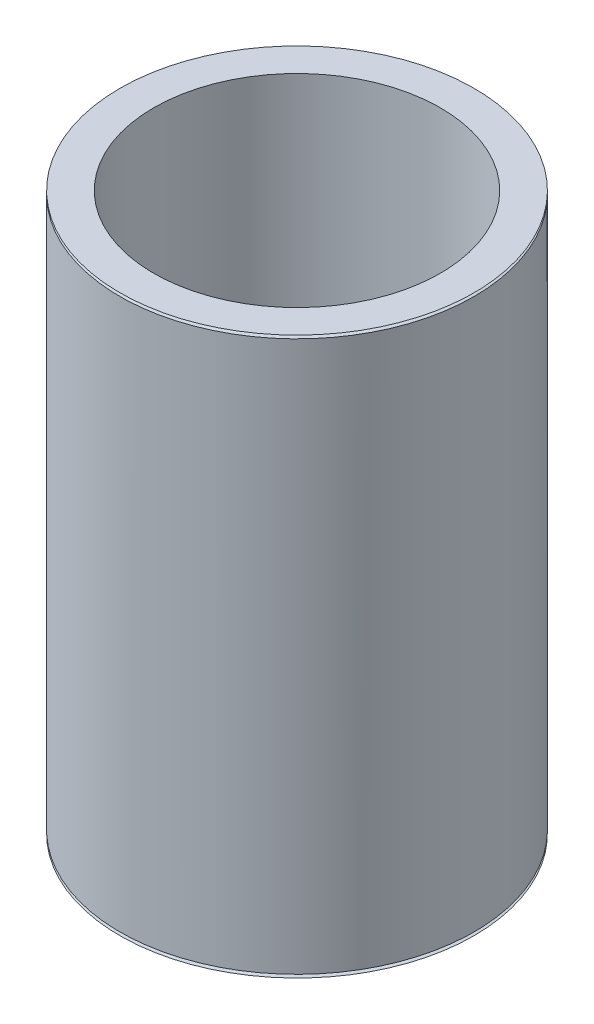
ISO-10303-21;
HEADER;
FILE_DESCRIPTION(('STEP AP214'),'2;1');
FILE_NAME('part.step','',(''),(''),'','','');
FILE_SCHEMA(('AUTOMOTIVE_DESIGN { 1 0 10303 214 1 1 1 1 }'));
ENDSEC;
DATA;
#1=APPLICATION_CONTEXT('core data for automotive mechanical design processes');
#2=APPLICATION_PROTOCOL_DEFINITION('international standard','automotive_design',2000,#1);
#3=PRODUCT_CONTEXT('',#1,'mechanical');
#4=PRODUCT('Part','Part','',(#3));
#5=PRODUCT_RELATED_PRODUCT_CATEGORY('part','',(#4));
#6=PRODUCT_DEFINITION_FORMATION('','',#4);
#7=PRODUCT_DEFINITION_CONTEXT('part definition',#1,'design');
#8=PRODUCT_DEFINITION('design','',#6,#7);
#9=PRODUCT_DEFINITION_SHAPE('','',#8);
#10=(LENGTH_UNIT() NAMED_UNIT(*) SI_UNIT(.MILLI.,.METRE.));
#11=(NAMED_UNIT(*) PLANE_ANGLE_UNIT() SI_UNIT($,.RADIAN.));
#12=(NAMED_UNIT(*) SI_UNIT($,.STERADIAN.) SOLID_ANGLE_UNIT());
#13=UNCERTAINTY_MEASURE_WITH_UNIT(LENGTH_MEASURE(1.E-05),#10,'distance_accuracy_value','');
#14=(GEOMETRIC_REPRESENTATION_CONTEXT(3) GLOBAL_UNCERTAINTY_ASSIGNED_CONTEXT((#13)) GLOBAL_UNIT_ASSIGNED_CONTEXT((#10,
#11,#12)) REPRESENTATION_CONTEXT('',''));
#15=CARTESIAN_POINT('',(0.,0.,0.));
#16=DIRECTION('',(0.,0.,1.));
#17=DIRECTION('',(1.,0.,0.));
#18=AXIS2_PLACEMENT_3D('',#15,#16,#17);
#19=CARTESIAN_POINT('',(0.,0.2339613525166,0.));
#20=DIRECTION('',(0.,-1.,0.));
#21=DIRECTION('',(-1.,0.,0.));
#22=AXIS2_PLACEMENT_3D('',#19,#20,#21);
#23=CONICAL_SURFACE('',#22,52.40859016499,1.32469745646832);
#24=CARTESIAN_POINT('',(0.,0.,0.));
#25=DIRECTION('',(0.,-1.,0.));
#26=DIRECTION('',(1.,0.,0.));
#27=AXIS2_PLACEMENT_3D('',#24,#25,#26);
#28=CIRCLE('',#27,53.34);
#29=CARTESIAN_POINT('',(53.34,-6.41153796721028E-13,0.));
#30=VERTEX_POINT('',#29);
#31=EDGE_CURVE('E101',#30,#30,#28,.T.);
#32=ORIENTED_EDGE('',*,*,#31,.F.);
#33=DIRECTION('',(-0.969870201350335,0.243622233247833,0.));
#34=VECTOR('',#33,1.);
#35=CARTESIAN_POINT('',(52.40859016499,0.2339613525166,0.));
#36=LINE('',#35,#34);
#37=CARTESIAN_POINT('',(51.4771803299801,0.46792270503385,0.));
#38=VERTEX_POINT('',#37);
#39=EDGE_CURVE('E11',#30,#38,#36,.T.);
#40=ORIENTED_EDGE('',*,*,#39,.T.);
#41=CARTESIAN_POINT('',(0.,0.4679227050333,0.));
#42=DIRECTION('',(0.,1.,0.));
#43=DIRECTION('',(1.,0.,0.));
#44=AXIS2_PLACEMENT_3D('',#41,#42,#43);
#45=CIRCLE('',#44,51.47718032998);
#46=CARTESIAN_POINT('',(-51.47718032998,0.4679227050333,0.));
#47=VERTEX_POINT('',#46);
#48=EDGE_CURVE('E120',#47,#38,#45,.T.);
#49=ORIENTED_EDGE('',*,*,#48,.F.);
#50=CARTESIAN_POINT('',(0.,0.4679227050333,0.));
#51=DIRECTION('',(0.,1.,0.));
#52=DIRECTION('',(1.,0.,0.));
#53=AXIS2_PLACEMENT_3D('',#50,#51,#52);
#54=CIRCLE('',#53,51.47718032998);
#55=EDGE_CURVE('E28',#38,#47,#54,.T.);
#56=ORIENTED_EDGE('',*,*,#55,.F.);
#57=ORIENTED_EDGE('',*,*,#39,.F.);
#58=EDGE_LOOP('',(#32,#40,#49,#56,#57));
#59=FACE_BOUND('',#58,.T.);
#60=ADVANCED_FACE('F17',(#59),#23,.T.);
#61=CARTESIAN_POINT('',(0.,0.7185706505834,0.));
#62=DIRECTION('',(0.,1.,0.));
#63=DIRECTION('',(1.,0.,0.));
#64=AXIS2_PLACEMENT_3D('',#61,#62,#63);
#65=CONICAL_SURFACE('',#64,52.40859016499,1.30791796485218);
#66=CARTESIAN_POINT('',(0.,0.9692185961335,0.));
#67=DIRECTION('',(0.,1.,0.));
#68=DIRECTION('',(1.,0.,0.));
#69=AXIS2_PLACEMENT_3D('',#66,#67,#68);
#70=CIRCLE('',#69,53.34);
#71=CARTESIAN_POINT('',(-53.34,0.9692185961335,0.));
#72=VERTEX_POINT('',#71);
#73=EDGE_CURVE('E114',#72,#72,#70,.T.);
#74=ORIENTED_EDGE('',*,*,#73,.F.);
#75=DIRECTION('',(0.965646005027503,-0.259861103234831,0.));
#76=VECTOR('',#75,1.);
#77=CARTESIAN_POINT('',(-52.40859016499,0.7185706505834,0.));
#78=LINE('',#77,#76);
#79=EDGE_CURVE('E124',#72,#47,#78,.T.);
#80=ORIENTED_EDGE('',*,*,#79,.T.);
#81=ORIENTED_EDGE('',*,*,#48,.T.);
#82=ORIENTED_EDGE('',*,*,#55,.T.);
#83=ORIENTED_EDGE('',*,*,#79,.F.);
#84=EDGE_LOOP('',(#74,#80,#81,#82,#83));
#85=FACE_BOUND('',#84,.T.);
#86=ADVANCED_FACE('F153',(#85),#65,.T.);
#87=CARTESIAN_POINT('',(0.,-8.385,0.));
#88=DIRECTION('',(0.,1.,0.));
#89=DIRECTION('',(1.,0.,0.));
#90=AXIS2_PLACEMENT_3D('',#87,#88,#89);
#91=CYLINDRICAL_SURFACE('',#90,53.34);
#92=CARTESIAN_POINT('',(0.,166.7306876233,0.));
#93=DIRECTION('',(0.,1.,0.));
#94=DIRECTION('',(1.,0.,0.));
#95=AXIS2_PLACEMENT_3D('',#92,#93,#94);
#96=CIRCLE('',#95,53.34);
#97=CARTESIAN_POINT('',(-53.34,166.7306876233,0.));
#98=VERTEX_POINT('',#97);
#99=CARTESIAN_POINT('',(53.3400000000205,166.730687623381,0.));
#100=VERTEX_POINT('',#99);
#101=EDGE_CURVE('E126',#98,#100,#96,.T.);
#102=ORIENTED_EDGE('',*,*,#101,.F.);
#103=DIRECTION('',(0.,-1.,0.));
#104=VECTOR('',#103,1.);
#105=CARTESIAN_POINT('',(-53.34,-8.385,0.));
#106=LINE('',#105,#104);
#107=EDGE_CURVE('E111',#98,#72,#106,.T.);
#108=ORIENTED_EDGE('',*,*,#107,.T.);
#109=ORIENTED_EDGE('',*,*,#73,.T.);
#110=ORIENTED_EDGE('',*,*,#107,.F.);
#111=CARTESIAN_POINT('',(0.,166.7306876233,0.));
#112=DIRECTION('',(0.,1.,0.));
#113=DIRECTION('',(1.,0.,0.));
#114=AXIS2_PLACEMENT_3D('',#111,#112,#113);
#115=CIRCLE('',#114,53.34);
#116=EDGE_CURVE('E115',#100,#98,#115,.T.);
#117=ORIENTED_EDGE('',*,*,#116,.F.);
#118=EDGE_LOOP('',(#102,#108,#109,#110,#117));
#119=FACE_BOUND('',#118,.T.);
#120=ADVANCED_FACE('F156',(#119),#91,.T.);
#121=CARTESIAN_POINT('',(0.,166.9362708563,0.));
#122=DIRECTION('',(0.,-1.,0.));
#123=DIRECTION('',(-1.,0.,0.));
#124=AXIS2_PLACEMENT_3D('',#121,#122,#123);
#125=CONICAL_SURFACE('',#124,52.52156463455,1.32469745646832);
#126=ORIENTED_EDGE('',*,*,#101,.T.);
#127=DIRECTION('',(-0.969870201350335,0.243622233247833,0.));
#128=VECTOR('',#127,1.);
#129=CARTESIAN_POINT('',(52.52156463455,166.9362708563,0.));
#130=LINE('',#129,#128);
#131=CARTESIAN_POINT('',(51.7031292691032,167.141854089213,0.));
#132=VERTEX_POINT('',#131);
#133=EDGE_CURVE('E127',#100,#132,#130,.T.);
#134=ORIENTED_EDGE('',*,*,#133,.T.);
#135=CARTESIAN_POINT('',(0.,167.1418540892,0.));
#136=DIRECTION('',(0.,1.,0.));
#137=DIRECTION('',(1.,0.,0.));
#138=AXIS2_PLACEMENT_3D('',#135,#136,#137);
#139=CIRCLE('',#138,51.7031292691);
#140=CARTESIAN_POINT('',(-51.7031292691,167.1418540892,0.));
#141=VERTEX_POINT('',#140);
#142=EDGE_CURVE('E21',#141,#132,#139,.T.);
#143=ORIENTED_EDGE('',*,*,#142,.F.);
#144=CARTESIAN_POINT('',(0.,167.1418540892,0.));
#145=DIRECTION('',(0.,1.,0.));
#146=DIRECTION('',(1.,0.,0.));
#147=AXIS2_PLACEMENT_3D('',#144,#145,#146);
#148=CIRCLE('',#147,51.7031292691);
#149=EDGE_CURVE('E62',#132,#141,#148,.T.);
#150=ORIENTED_EDGE('',*,*,#149,.F.);
#151=ORIENTED_EDGE('',*,*,#133,.F.);
#152=ORIENTED_EDGE('',*,*,#116,.T.);
#153=EDGE_LOOP('',(#126,#134,#143,#150,#151,#152));
#154=FACE_BOUND('',#153,.T.);
#155=ADVANCED_FACE('F19',(#154),#125,.T.);
#156=CARTESIAN_POINT('',(0.,167.4209270446,0.));
#157=DIRECTION('',(0.,1.,0.));
#158=DIRECTION('',(1.,0.,0.));
#159=AXIS2_PLACEMENT_3D('',#156,#157,#158);
#160=CONICAL_SURFACE('',#159,52.52156463455,1.2421764960508);
#161=CARTESIAN_POINT('',(0.,167.7,0.));
#162=DIRECTION('',(0.,1.,0.));
#163=DIRECTION('',(1.,0.,0.));
#164=AXIS2_PLACEMENT_3D('',#161,#162,#163);
#165=CIRCLE('',#164,53.34);
#166=CARTESIAN_POINT('',(-53.34,167.7,0.));
#167=VERTEX_POINT('',#166);
#168=EDGE_CURVE('E117',#167,#167,#165,.T.);
#169=ORIENTED_EDGE('',*,*,#168,.F.);
#170=DIRECTION('',(0.946488676569421,-0.32273702162266,0.));
#171=VECTOR('',#170,1.);
#172=CARTESIAN_POINT('',(-52.52156463455,167.4209270446,0.));
#173=LINE('',#172,#171);
#174=EDGE_CURVE('E73',#167,#141,#173,.T.);
#175=ORIENTED_EDGE('',*,*,#174,.T.);
#176=ORIENTED_EDGE('',*,*,#142,.T.);
#177=ORIENTED_EDGE('',*,*,#149,.T.);
#178=ORIENTED_EDGE('',*,*,#174,.F.);
#179=EDGE_LOOP('',(#169,#175,#176,#177,#178));
#180=FACE_BOUND('',#179,.T.);
#181=ADVANCED_FACE('F198',(#180),#160,.T.);
#182=CARTESIAN_POINT('',(0.,167.7,0.));
#183=DIRECTION('',(0.,1.,0.));
#184=DIRECTION('',(1.,0.,0.));
#185=AXIS2_PLACEMENT_3D('',#182,#183,#184);
#186=PLANE('',#185);
#187=CARTESIAN_POINT('',(0.,167.7,0.));
#188=DIRECTION('',(0.,1.,0.));
#189=DIRECTION('',(1.,0.,0.));
#190=AXIS2_PLACEMENT_3D('',#187,#188,#189);
#191=CIRCLE('',#190,43.18);
#192=CARTESIAN_POINT('',(-43.18,167.7,0.));
#193=VERTEX_POINT('',#192);
#194=EDGE_CURVE('E94',#193,#193,#191,.T.);
#195=ORIENTED_EDGE('',*,*,#194,.F.);
#196=EDGE_LOOP('',(#195));
#197=FACE_BOUND('',#196,.T.);
#198=ORIENTED_EDGE('',*,*,#168,.T.);
#199=EDGE_LOOP('',(#198));
#200=FACE_BOUND('',#199,.T.);
#201=ADVANCED_FACE('F258',(#197,#200),#186,.T.);
#202=CARTESIAN_POINT('',(0.,-8.385,0.));
#203=DIRECTION('',(0.,1.,0.));
#204=DIRECTION('',(1.,0.,0.));
#205=AXIS2_PLACEMENT_3D('',#202,#203,#204);
#206=CYLINDRICAL_SURFACE('',#205,43.18);
#207=CARTESIAN_POINT('',(0.,0.,0.));
#208=DIRECTION('',(0.,1.,0.));
#209=DIRECTION('',(1.,0.,0.));
#210=AXIS2_PLACEMENT_3D('',#207,#208,#209);
#211=CIRCLE('',#210,43.18);
#212=CARTESIAN_POINT('',(-43.18,0.,0.));
#213=VERTEX_POINT('',#212);
#214=EDGE_CURVE('E92',#213,#213,#211,.T.);
#215=ORIENTED_EDGE('',*,*,#214,.F.);
#216=DIRECTION('',(0.,1.,0.));
#217=VECTOR('',#216,1.);
#218=CARTESIAN_POINT('',(-43.18,-8.385,0.));
#219=LINE('',#218,#217);
#220=EDGE_CURVE('E89',#213,#193,#219,.T.);
#221=ORIENTED_EDGE('',*,*,#220,.T.);
#222=ORIENTED_EDGE('',*,*,#194,.T.);
#223=ORIENTED_EDGE('',*,*,#220,.F.);
#224=EDGE_LOOP('',(#215,#221,#222,#223));
#225=FACE_BOUND('',#224,.T.);
#226=ADVANCED_FACE('F91',(#225),#206,.F.);
#227=CARTESIAN_POINT('',(0.,0.,0.));
#228=DIRECTION('',(0.,1.,0.));
#229=DIRECTION('',(1.,0.,0.));
#230=AXIS2_PLACEMENT_3D('',#227,#228,#229);
#231=PLANE('',#230);
#232=ORIENTED_EDGE('',*,*,#214,.T.);
#233=EDGE_LOOP('',(#232));
#234=FACE_BOUND('',#233,.T.);
#235=ORIENTED_EDGE('',*,*,#31,.T.);
#236=EDGE_LOOP('',(#235));
#237=FACE_BOUND('',#236,.T.);
#238=ADVANCED_FACE('F98',(#234,#237),#231,.F.);
#239=CLOSED_SHELL('',(#60,#86,#120,#155,#181,#201,#226,#238));
#240=MANIFOLD_SOLID_BREP('B1',#239);
#241=ADVANCED_BREP_SHAPE_REPRESENTATION('',(#18,#240),#14);
#242=SHAPE_DEFINITION_REPRESENTATION(#9,#241);
ENDSEC;
END-ISO-10303-21;
